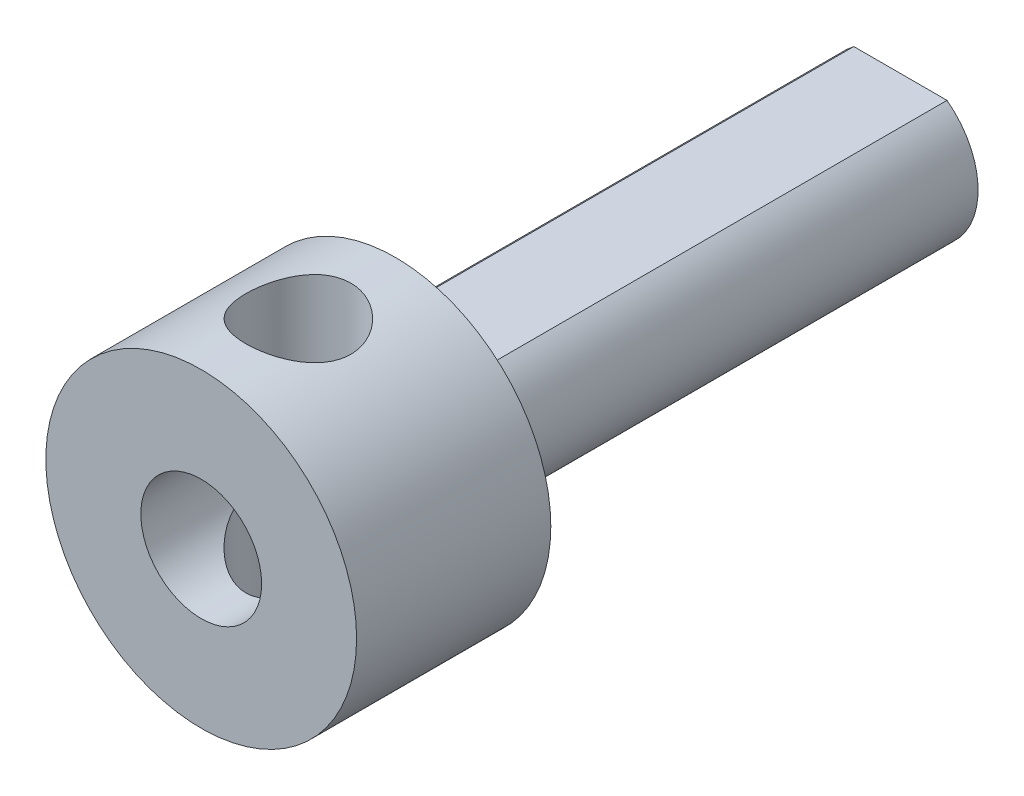
ISO-10303-21;
HEADER;
FILE_DESCRIPTION(('STEP AP214'),'2;1');
FILE_NAME('part.step','',(''),(''),'','','');
FILE_SCHEMA(('AUTOMOTIVE_DESIGN { 1 0 10303 214 1 1 1 1 }'));
ENDSEC;
DATA;
#1=APPLICATION_CONTEXT('core data for automotive mechanical design processes');
#2=APPLICATION_PROTOCOL_DEFINITION('international standard','automotive_design',2000,#1);
#3=PRODUCT_CONTEXT('',#1,'mechanical');
#4=PRODUCT('Part','Part','',(#3));
#5=PRODUCT_RELATED_PRODUCT_CATEGORY('part','',(#4));
#6=PRODUCT_DEFINITION_FORMATION('','',#4);
#7=PRODUCT_DEFINITION_CONTEXT('part definition',#1,'design');
#8=PRODUCT_DEFINITION('design','',#6,#7);
#9=PRODUCT_DEFINITION_SHAPE('','',#8);
#10=(LENGTH_UNIT() NAMED_UNIT(*) SI_UNIT(.MILLI.,.METRE.));
#11=(NAMED_UNIT(*) PLANE_ANGLE_UNIT() SI_UNIT($,.RADIAN.));
#12=(NAMED_UNIT(*) SI_UNIT($,.STERADIAN.) SOLID_ANGLE_UNIT());
#13=UNCERTAINTY_MEASURE_WITH_UNIT(LENGTH_MEASURE(1.E-05),#10,'distance_accuracy_value','');
#14=(GEOMETRIC_REPRESENTATION_CONTEXT(3) GLOBAL_UNCERTAINTY_ASSIGNED_CONTEXT((#13)) GLOBAL_UNIT_ASSIGNED_CONTEXT((#10,
#11,#12)) REPRESENTATION_CONTEXT('',''));
#15=CARTESIAN_POINT('',(0.,0.,0.));
#16=DIRECTION('',(0.,0.,1.));
#17=DIRECTION('',(1.,0.,0.));
#18=AXIS2_PLACEMENT_3D('',#15,#16,#17);
#19=CARTESIAN_POINT('',(0.,0.,0.));
#20=DIRECTION('',(0.,0.,1.));
#21=DIRECTION('',(1.,0.,0.));
#22=AXIS2_PLACEMENT_3D('',#19,#20,#21);
#23=PLANE('',#22);
#24=CARTESIAN_POINT('',(0.,0.,0.));
#25=DIRECTION('',(0.,0.,1.));
#26=DIRECTION('',(1.,0.,0.));
#27=AXIS2_PLACEMENT_3D('',#24,#25,#26);
#28=CIRCLE('',#27,4.);
#29=CARTESIAN_POINT('',(4.,0.,0.));
#30=VERTEX_POINT('',#29);
#31=EDGE_CURVE('E90',#30,#30,#28,.T.);
#32=ORIENTED_EDGE('',*,*,#31,.F.);
#33=EDGE_LOOP('',(#32));
#34=FACE_BOUND('',#33,.T.);
#35=CARTESIAN_POINT('',(0.,0.,0.));
#36=DIRECTION('',(0.,0.,-1.));
#37=DIRECTION('',(-1.,0.,0.));
#38=AXIS2_PLACEMENT_3D('',#35,#36,#37);
#39=CIRCLE('',#38,2.);
#40=CARTESIAN_POINT('',(1.2,1.6,0.));
#41=VERTEX_POINT('',#40);
#42=CARTESIAN_POINT('',(-1.2,1.6,0.));
#43=VERTEX_POINT('',#42);
#44=EDGE_CURVE('E54',#41,#43,#39,.T.);
#45=ORIENTED_EDGE('',*,*,#44,.F.);
#46=DIRECTION('',(-1.,0.,0.));
#47=VECTOR('',#46,1.);
#48=CARTESIAN_POINT('',(0.,1.6,0.));
#49=LINE('',#48,#47);
#50=EDGE_CURVE('E68',#41,#43,#49,.T.);
#51=ORIENTED_EDGE('',*,*,#50,.T.);
#52=EDGE_LOOP('',(#45,#51));
#53=FACE_BOUND('',#52,.T.);
#54=ADVANCED_FACE('F35',(#34,#53),#23,.F.);
#55=CARTESIAN_POINT('',(0.,0.,5.));
#56=DIRECTION('',(0.,0.,-1.));
#57=DIRECTION('',(-1.,0.,0.));
#58=AXIS2_PLACEMENT_3D('',#55,#56,#57);
#59=CYLINDRICAL_SURFACE('',#58,4.);
#60=CARTESIAN_POINT('',(0.,-4.,3.85254999999999));
#61=CARTESIAN_POINT('',(0.0737390509618184,-4.0000003652744,3.85255056006));
#62=CARTESIAN_POINT('',(0.147474310927837,-3.9979422676283,3.8465002378604));
#63=CARTESIAN_POINT('',(0.292769357385458,-3.98993514213324,3.82253545367694));
#64=CARTESIAN_POINT('',(0.364328979769022,-3.98398582152813,3.80462009902608));
#65=CARTESIAN_POINT('',(0.503157126306701,-3.96884184238156,3.75761210627711));
#66=CARTESIAN_POINT('',(0.570432722546803,-3.95965270522232,3.72853847699066));
#67=CARTESIAN_POINT('',(0.699152411861926,-3.93896448953899,3.66012633786681));
#68=CARTESIAN_POINT('',(0.760595299451358,-3.92746493502911,3.62078571235117));
#69=CARTESIAN_POINT('',(0.878087591662698,-3.90290684204576,3.5314897810976));
#70=CARTESIAN_POINT('',(0.933901351542575,-3.88981017965103,3.48123497253421));
#71=CARTESIAN_POINT('',(1.03648991777588,-3.86374115173317,3.372173848154));
#72=CARTESIAN_POINT('',(1.08326265549071,-3.85076881530033,3.31336558063725));
#73=CARTESIAN_POINT('',(1.16780306583327,-3.82599515792021,3.18672573613668));
#74=CARTESIAN_POINT('',(1.20526152944493,-3.81424014143166,3.11867780615096));
#75=CARTESIAN_POINT('',(1.2681013612762,-3.793813224202,2.97678648985272));
#76=CARTESIAN_POINT('',(1.29348653752226,-3.78514035154269,2.90294493947356));
#77=CARTESIAN_POINT('',(1.33057003933591,-3.77226179997908,2.75424635412494));
#78=CARTESIAN_POINT('',(1.34271089853046,-3.76791214685453,2.67951252606679));
#79=CARTESIAN_POINT('',(1.35434465925974,-3.76374712025534,2.52895169315452));
#80=CARTESIAN_POINT('',(1.35384160460854,-3.76393029707729,2.45312504556309));
#81=CARTESIAN_POINT('',(1.34054483005336,-3.76868428428414,2.3063337611442));
#82=CARTESIAN_POINT('',(1.32833239185101,-3.77304757543275,2.23530857478513));
#83=CARTESIAN_POINT('',(1.29291317512871,-3.78533000773349,2.09638185022601));
#84=CARTESIAN_POINT('',(1.26970504439218,-3.79324958622069,2.02848069733709));
#85=CARTESIAN_POINT('',(1.2125796956735,-3.81189752199324,1.89642399978096));
#86=CARTESIAN_POINT('',(1.17849266093029,-3.82266992332552,1.83234840398385));
#87=CARTESIAN_POINT('',(1.10069502115956,-3.84579168954526,1.71064455357942));
#88=CARTESIAN_POINT('',(1.05698157221814,-3.85814151999593,1.6530182118671));
#89=CARTESIAN_POINT('',(0.958394767498534,-3.88383915451425,1.54258739983186));
#90=CARTESIAN_POINT('',(0.903047375464347,-3.89720489555063,1.49020941408974));
#91=CARTESIAN_POINT('',(0.784190835217096,-3.92284799554659,1.39536555047655));
#92=CARTESIAN_POINT('',(0.720680859092592,-3.9351252438892,1.35290067930123));
#93=CARTESIAN_POINT('',(0.586377478003401,-3.95737745603798,1.27873171963862));
#94=CARTESIAN_POINT('',(0.515514792387584,-3.96732697545626,1.24714492256861));
#95=CARTESIAN_POINT('',(0.369064286005889,-3.98361761388867,1.19647367635713));
#96=CARTESIAN_POINT('',(0.29347816699625,-3.9899600242462,1.17738475261223));
#97=CARTESIAN_POINT('',(0.143334606318407,-3.99810645778428,1.15301369278033));
#98=CARTESIAN_POINT('',(0.0688808146920541,-4.00009970292712,1.14715549388714));
#99=CARTESIAN_POINT('',(-0.0799626683313179,-3.99989262166952,1.14776720531911));
#100=CARTESIAN_POINT('',(-0.154352368641951,-3.9976930264654,1.15423496609985));
#101=CARTESIAN_POINT('',(-0.298630325753243,-3.98947237211125,1.17886093786743));
#102=CARTESIAN_POINT('',(-0.368586673962148,-3.98356782182736,1.19666296475717));
#103=CARTESIAN_POINT('',(-0.504489462163015,-3.96864809967418,1.24300423049516));
#104=CARTESIAN_POINT('',(-0.570435386895209,-3.95963252908952,1.27154484566742));
#105=CARTESIAN_POINT('',(-0.698410294101007,-3.93910368260848,1.33939669099171));
#106=CARTESIAN_POINT('',(-0.760287564381749,-3.92753011320835,1.37897529645741));
#107=CARTESIAN_POINT('',(-0.876708176692176,-3.9031943071523,1.46746695977094));
#108=CARTESIAN_POINT('',(-0.931249212732041,-3.89043169887101,1.51638294099124));
#109=CARTESIAN_POINT('',(-1.03410865095364,-3.86439742013857,1.62486854702729));
#110=CARTESIAN_POINT('',(-1.08201607624762,-3.85112989689448,1.68482978528195));
#111=CARTESIAN_POINT('',(-1.1671430673832,-3.82619275797566,1.81222339044417));
#112=CARTESIAN_POINT('',(-1.20436246945168,-3.81452316678755,1.87965587181204));
#113=CARTESIAN_POINT('',(-1.26690207526012,-3.79421204563183,2.02015433486791));
#114=CARTESIAN_POINT('',(-1.29223999157417,-3.78556601315449,2.09321174056244));
#115=CARTESIAN_POINT('',(-1.33013343190278,-3.77242033377096,2.24291805866598));
#116=CARTESIAN_POINT('',(-1.34269493711504,-3.76791874676199,2.31956527293252));
#117=CARTESIAN_POINT('',(-1.35420428715988,-3.76379652207792,2.46991853348414));
#118=CARTESIAN_POINT('',(-1.35383624769368,-3.76393060026203,2.54356605318321));
#119=CARTESIAN_POINT('',(-1.34118827642512,-3.76845566270461,2.68969093920701));
#120=CARTESIAN_POINT('',(-1.32890909347553,-3.7728463793485,2.76216837880338));
#121=CARTESIAN_POINT('',(-1.29327749830683,-3.78520481653253,2.90244091757961));
#122=CARTESIAN_POINT('',(-1.27015285741645,-3.7930987880036,2.9703008866313));
#123=CARTESIAN_POINT('',(-1.21367284791613,-3.81154517911969,3.10122880348786));
#124=CARTESIAN_POINT('',(-1.18031516760581,-3.82209819936226,3.16429566448212));
#125=CARTESIAN_POINT('',(-1.10257812997164,-3.84526124892901,3.28690186227075));
#126=CARTESIAN_POINT('',(-1.0577729746199,-3.85794211029656,3.34615775539958));
#127=CARTESIAN_POINT('',(-0.959125818306253,-3.88364165900639,3.45653058996261));
#128=CARTESIAN_POINT('',(-0.905281227791766,-3.89666044224806,3.50764519093755));
#129=CARTESIAN_POINT('',(-0.787463330671121,-3.92220271600919,3.60237630003147));
#130=CARTESIAN_POINT('',(-0.723167865506797,-3.93468472207405,3.64560476128542));
#131=CARTESIAN_POINT('',(-0.587808236572525,-3.95716814430872,3.72059634415163));
#132=CARTESIAN_POINT('',(-0.516745575892186,-3.96717010956017,3.75236200434126));
#133=CARTESIAN_POINT('',(-0.372423161492995,-3.98326295233837,3.80242809971874));
#134=CARTESIAN_POINT('',(-0.299328134068115,-3.98947881260907,3.82116212002658));
#135=CARTESIAN_POINT('',(-0.150820286948907,-3.99784654720756,3.84622094419734));
#136=CARTESIAN_POINT('',(-0.0754081611948086,-3.99999962645748,3.85254942726283));
#137=CARTESIAN_POINT('',(0.,-4.,3.85254999999999));
#138=B_SPLINE_CURVE_WITH_KNOTS('',3,(#60,#61,#62,#63,#64,#65,#66,#67,#68,#69,#70,#71,#72,#73,
#74,#75,#76,#77,#78,#79,#80,#81,#82,#83,#84,#85,#86,#87,#88,#89,#90,#91,#92,#93,#94,#95,#96,#97,
#98,#99,#100,#101,#102,#103,#104,#105,#106,#107,#108,#109,#110,#111,#112,#113,#114,#115,#116,
#117,#118,#119,#120,#121,#122,#123,#124,#125,#126,#127,#128,#129,#130,#131,#132,#133,#134,#135,
#136,#137),.UNSPECIFIED.,.T.,.F.,(4,2,2,2,2,2,2,2,2,2,2,2,2,2,2,2,2,2,2,2,2,2,2,2,2,2,2,2,2,2,2,
2,2,2,2,2,2,2,4),(0.,0.220939581068784,0.441895786439387,0.662477238152886,0.88310418013091,
1.11079439594426,1.33853664709934,1.57305252102399,1.80749437733888,2.03383714603689,
2.26010752603993,2.47569718163393,2.69131335666791,2.91047495342985,3.12970138376854,
3.3607276034257,3.59177727404101,3.82524545926201,4.058630010282,4.28163932601376,
4.50460975434197,4.72089753822,4.93721305232834,5.15930761136237,5.38147181878623,
5.61403918754245,5.84661011975027,6.07883323098321,6.31094757829824,6.53079998026519,
6.7506385610225,6.96605385334918,7.18151784506628,7.4066072008356,7.63176114896825,
7.86604414860135,8.10027523151229,8.32628289926542,8.55222352809417),.UNSPECIFIED.);
#139=CARTESIAN_POINT('',(0.,-4.,3.85254999999999));
#140=VERTEX_POINT('',#139);
#141=EDGE_CURVE('E11',#140,#140,#138,.T.);
#142=ORIENTED_EDGE('',*,*,#141,.T.);
#143=EDGE_LOOP('',(#142));
#144=FACE_BOUND('',#143,.T.);
#145=CARTESIAN_POINT('',(0.,4.,3.85254999999999));
#146=CARTESIAN_POINT('',(-0.0737390509618184,4.0000003652744,3.85255056006));
#147=CARTESIAN_POINT('',(-0.147474310927837,3.9979422676283,3.8465002378604));
#148=CARTESIAN_POINT('',(-0.292769357385458,3.98993514213324,3.82253545367694));
#149=CARTESIAN_POINT('',(-0.364328979769022,3.98398582152813,3.80462009902608));
#150=CARTESIAN_POINT('',(-0.503157126306701,3.96884184238156,3.75761210627711));
#151=CARTESIAN_POINT('',(-0.570432722546803,3.95965270522232,3.72853847699066));
#152=CARTESIAN_POINT('',(-0.699152411861926,3.93896448953899,3.66012633786681));
#153=CARTESIAN_POINT('',(-0.760595299451358,3.92746493502911,3.62078571235117));
#154=CARTESIAN_POINT('',(-0.878087591662698,3.90290684204576,3.5314897810976));
#155=CARTESIAN_POINT('',(-0.933901351542575,3.88981017965103,3.48123497253421));
#156=CARTESIAN_POINT('',(-1.03648991777588,3.86374115173317,3.372173848154));
#157=CARTESIAN_POINT('',(-1.08326265549071,3.85076881530033,3.31336558063725));
#158=CARTESIAN_POINT('',(-1.16780306583327,3.82599515792021,3.18672573613668));
#159=CARTESIAN_POINT('',(-1.20526152944493,3.81424014143166,3.11867780615096));
#160=CARTESIAN_POINT('',(-1.2681013612762,3.793813224202,2.97678648985272));
#161=CARTESIAN_POINT('',(-1.29348653752226,3.78514035154269,2.90294493947356));
#162=CARTESIAN_POINT('',(-1.33057003933591,3.77226179997908,2.75424635412494));
#163=CARTESIAN_POINT('',(-1.34271089853046,3.76791214685453,2.67951252606679));
#164=CARTESIAN_POINT('',(-1.35434465925974,3.76374712025534,2.52895169315452));
#165=CARTESIAN_POINT('',(-1.35384160460854,3.76393029707729,2.45312504556309));
#166=CARTESIAN_POINT('',(-1.34054483005336,3.76868428428414,2.3063337611442));
#167=CARTESIAN_POINT('',(-1.32833239185101,3.77304757543275,2.23530857478513));
#168=CARTESIAN_POINT('',(-1.29291317512871,3.78533000773349,2.09638185022601));
#169=CARTESIAN_POINT('',(-1.26970504439218,3.79324958622069,2.02848069733709));
#170=CARTESIAN_POINT('',(-1.2125796956735,3.81189752199324,1.89642399978096));
#171=CARTESIAN_POINT('',(-1.17849266093029,3.82266992332552,1.83234840398385));
#172=CARTESIAN_POINT('',(-1.10069502115956,3.84579168954526,1.71064455357942));
#173=CARTESIAN_POINT('',(-1.05698157221814,3.85814151999593,1.6530182118671));
#174=CARTESIAN_POINT('',(-0.958394767498534,3.88383915451425,1.54258739983186));
#175=CARTESIAN_POINT('',(-0.903047375464347,3.89720489555063,1.49020941408974));
#176=CARTESIAN_POINT('',(-0.784190835217096,3.92284799554659,1.39536555047655));
#177=CARTESIAN_POINT('',(-0.720680859092592,3.9351252438892,1.35290067930123));
#178=CARTESIAN_POINT('',(-0.586377478003401,3.95737745603798,1.27873171963862));
#179=CARTESIAN_POINT('',(-0.515514792387584,3.96732697545626,1.24714492256861));
#180=CARTESIAN_POINT('',(-0.369064286005889,3.98361761388867,1.19647367635713));
#181=CARTESIAN_POINT('',(-0.29347816699625,3.9899600242462,1.17738475261223));
#182=CARTESIAN_POINT('',(-0.143334606318407,3.99810645778428,1.15301369278033));
#183=CARTESIAN_POINT('',(-0.0688808146920541,4.00009970292712,1.14715549388714));
#184=CARTESIAN_POINT('',(0.0799626683313179,3.99989262166952,1.14776720531911));
#185=CARTESIAN_POINT('',(0.154352368641951,3.9976930264654,1.15423496609985));
#186=CARTESIAN_POINT('',(0.298630325753243,3.98947237211125,1.17886093786743));
#187=CARTESIAN_POINT('',(0.368586673962148,3.98356782182736,1.19666296475717));
#188=CARTESIAN_POINT('',(0.504489462163015,3.96864809967418,1.24300423049516));
#189=CARTESIAN_POINT('',(0.570435386895209,3.95963252908952,1.27154484566742));
#190=CARTESIAN_POINT('',(0.698410294101007,3.93910368260848,1.33939669099171));
#191=CARTESIAN_POINT('',(0.760287564381749,3.92753011320835,1.37897529645741));
#192=CARTESIAN_POINT('',(0.876708176692176,3.9031943071523,1.46746695977094));
#193=CARTESIAN_POINT('',(0.931249212732041,3.89043169887101,1.51638294099124));
#194=CARTESIAN_POINT('',(1.03410865095364,3.86439742013857,1.62486854702729));
#195=CARTESIAN_POINT('',(1.08201607624762,3.85112989689448,1.68482978528195));
#196=CARTESIAN_POINT('',(1.1671430673832,3.82619275797566,1.81222339044417));
#197=CARTESIAN_POINT('',(1.20436246945168,3.81452316678755,1.87965587181204));
#198=CARTESIAN_POINT('',(1.26690207526012,3.79421204563183,2.02015433486791));
#199=CARTESIAN_POINT('',(1.29223999157417,3.78556601315449,2.09321174056244));
#200=CARTESIAN_POINT('',(1.33013343190278,3.77242033377096,2.24291805866598));
#201=CARTESIAN_POINT('',(1.34269493711504,3.76791874676199,2.31956527293252));
#202=CARTESIAN_POINT('',(1.35420428715988,3.76379652207792,2.46991853348414));
#203=CARTESIAN_POINT('',(1.35383624769368,3.76393060026203,2.54356605318321));
#204=CARTESIAN_POINT('',(1.34118827642512,3.76845566270461,2.68969093920701));
#205=CARTESIAN_POINT('',(1.32890909347553,3.7728463793485,2.76216837880338));
#206=CARTESIAN_POINT('',(1.29327749830683,3.78520481653253,2.90244091757961));
#207=CARTESIAN_POINT('',(1.27015285741645,3.7930987880036,2.9703008866313));
#208=CARTESIAN_POINT('',(1.21367284791613,3.81154517911969,3.10122880348786));
#209=CARTESIAN_POINT('',(1.18031516760581,3.82209819936226,3.16429566448212));
#210=CARTESIAN_POINT('',(1.10257812997164,3.84526124892901,3.28690186227075));
#211=CARTESIAN_POINT('',(1.0577729746199,3.85794211029656,3.34615775539958));
#212=CARTESIAN_POINT('',(0.959125818306253,3.88364165900639,3.45653058996261));
#213=CARTESIAN_POINT('',(0.905281227791766,3.89666044224806,3.50764519093755));
#214=CARTESIAN_POINT('',(0.787463330671121,3.92220271600919,3.60237630003147));
#215=CARTESIAN_POINT('',(0.723167865506797,3.93468472207405,3.64560476128542));
#216=CARTESIAN_POINT('',(0.587808236572525,3.95716814430872,3.72059634415163));
#217=CARTESIAN_POINT('',(0.516745575892186,3.96717010956017,3.75236200434126));
#218=CARTESIAN_POINT('',(0.372423161492994,3.98326295233837,3.80242809971874));
#219=CARTESIAN_POINT('',(0.299328134068115,3.98947881260907,3.82116212002658));
#220=CARTESIAN_POINT('',(0.150820286948907,3.99784654720756,3.84622094419734));
#221=CARTESIAN_POINT('',(0.0754081611948085,3.99999962645748,3.85254942726283));
#222=CARTESIAN_POINT('',(0.,4.,3.85254999999999));
#223=B_SPLINE_CURVE_WITH_KNOTS('',3,(#145,#146,#147,#148,#149,#150,#151,#152,#153,#154,#155,
#156,#157,#158,#159,#160,#161,#162,#163,#164,#165,#166,#167,#168,#169,#170,#171,#172,#173,#174,
#175,#176,#177,#178,#179,#180,#181,#182,#183,#184,#185,#186,#187,#188,#189,#190,#191,#192,#193,
#194,#195,#196,#197,#198,#199,#200,#201,#202,#203,#204,#205,#206,#207,#208,#209,#210,#211,#212,
#213,#214,#215,#216,#217,#218,#219,#220,#221,#222),.UNSPECIFIED.,.T.,.F.,(4,2,2,2,2,2,2,2,2,2,2,
2,2,2,2,2,2,2,2,2,2,2,2,2,2,2,2,2,2,2,2,2,2,2,2,2,2,2,4),(0.,0.220939581068784,
0.441895786439387,0.662477238152887,0.88310418013091,1.11079439594426,1.33853664709934,
1.57305252102399,1.80749437733888,2.03383714603689,2.26010752603994,2.47569718163393,
2.69131335666791,2.91047495342985,3.12970138376854,3.3607276034257,3.59177727404101,
3.82524545926201,4.058630010282,4.28163932601376,4.50460975434197,4.72089753822,
4.93721305232834,5.15930761136237,5.38147181878623,5.61403918754246,5.84661011975027,
6.07883323098321,6.31094757829824,6.53079998026519,6.7506385610225,6.96605385334918,
7.18151784506628,7.4066072008356,7.63176114896825,7.86604414860135,8.10027523151229,
8.32628289926542,8.55222352809417),.UNSPECIFIED.);
#224=CARTESIAN_POINT('',(0.,4.,3.85254999999999));
#225=VERTEX_POINT('',#224);
#226=EDGE_CURVE('E48',#225,#225,#223,.T.);
#227=ORIENTED_EDGE('',*,*,#226,.T.);
#228=EDGE_LOOP('',(#227));
#229=FACE_BOUND('',#228,.T.);
#230=CARTESIAN_POINT('',(0.,0.,5.));
#231=DIRECTION('',(0.,0.,1.));
#232=DIRECTION('',(1.,0.,0.));
#233=AXIS2_PLACEMENT_3D('',#230,#231,#232);
#234=CIRCLE('',#233,4.);
#235=CARTESIAN_POINT('',(4.,0.,5.));
#236=VERTEX_POINT('',#235);
#237=EDGE_CURVE('E93',#236,#236,#234,.T.);
#238=ORIENTED_EDGE('',*,*,#237,.F.);
#239=EDGE_LOOP('',(#238));
#240=FACE_BOUND('',#239,.T.);
#241=ORIENTED_EDGE('',*,*,#31,.T.);
#242=EDGE_LOOP('',(#241));
#243=FACE_BOUND('',#242,.T.);
#244=ADVANCED_FACE('F37',(#144,#229,#240,#243),#59,.T.);
#245=CARTESIAN_POINT('',(0.,0.,5.));
#246=DIRECTION('',(0.,0.,1.));
#247=DIRECTION('',(1.,0.,0.));
#248=AXIS2_PLACEMENT_3D('',#245,#246,#247);
#249=PLANE('',#248);
#250=CARTESIAN_POINT('',(0.,0.,5.));
#251=DIRECTION('',(0.,0.,1.));
#252=DIRECTION('',(1.,0.,0.));
#253=AXIS2_PLACEMENT_3D('',#250,#251,#252);
#254=CIRCLE('',#253,1.555);
#255=CARTESIAN_POINT('',(1.555,0.,5.));
#256=VERTEX_POINT('',#255);
#257=EDGE_CURVE('E86',#256,#256,#254,.T.);
#258=ORIENTED_EDGE('',*,*,#257,.F.);
#259=EDGE_LOOP('',(#258));
#260=FACE_BOUND('',#259,.T.);
#261=ORIENTED_EDGE('',*,*,#237,.T.);
#262=EDGE_LOOP('',(#261));
#263=FACE_BOUND('',#262,.T.);
#264=ADVANCED_FACE('F129',(#260,#263),#249,.T.);
#265=CARTESIAN_POINT('',(0.,0.,1.));
#266=DIRECTION('',(0.,0.,1.));
#267=DIRECTION('',(1.,0.,0.));
#268=AXIS2_PLACEMENT_3D('',#265,#266,#267);
#269=CYLINDRICAL_SURFACE('',#268,1.555);
#270=CARTESIAN_POINT('',(0.,-1.555,3.85254999999999));
#271=CARTESIAN_POINT('',(-0.0634208857405645,-1.55499913362226,3.85254912161558));
#272=CARTESIAN_POINT('',(-0.126847740464505,-1.55108791734117,3.84805781385923));
#273=CARTESIAN_POINT('',(-0.251563549806269,-1.53580451745603,3.83044380329821));
#274=CARTESIAN_POINT('',(-0.312851314550988,-1.52442824892799,3.81731637474337));
#275=CARTESIAN_POINT('',(-0.431199602065749,-1.49525523055035,3.78344396178162));
#276=CARTESIAN_POINT('',(-0.488283344684581,-1.4774975310214,3.76274529508399));
#277=CARTESIAN_POINT('',(-0.597607002635973,-1.43676775537636,3.71483581733928));
#278=CARTESIAN_POINT('',(-0.649844989540499,-1.41379361574697,3.6876224289741));
#279=CARTESIAN_POINT('',(-0.768086683416059,-1.35424233213501,3.61618612506015));
#280=CARTESIAN_POINT('',(-0.831648341730146,-1.31583319960547,3.56944807837608));
#281=CARTESIAN_POINT('',(-0.948310836942764,-1.23443059840987,3.46753780036242));
#282=CARTESIAN_POINT('',(-1.00138325679002,-1.19142514978483,3.41234335753943));
#283=CARTESIAN_POINT('',(-1.09816505744701,-1.10291519547781,3.29337230124312));
#284=CARTESIAN_POINT('',(-1.14165006713979,-1.05737692192664,3.22943746818669));
#285=CARTESIAN_POINT('',(-1.19863934613538,-0.991032581108011,3.12781675863433));
#286=CARTESIAN_POINT('',(-1.21625487509267,-0.969257078871723,3.09301202211705));
#287=CARTESIAN_POINT('',(-1.24866897067999,-0.927121165811011,3.0213112908193));
#288=CARTESIAN_POINT('',(-1.26346973378204,-0.906759659532944,2.9844169560559));
#289=CARTESIAN_POINT('',(-1.29057220305554,-0.867774219774612,2.90689562384742));
#290=CARTESIAN_POINT('',(-1.30276032346032,-0.849243226617585,2.8661807891439));
#291=CARTESIAN_POINT('',(-1.32349548339746,-0.816554009150317,2.78216053780056));
#292=CARTESIAN_POINT('',(-1.33205003848289,-0.80238677583235,2.73886068174997));
#293=CARTESIAN_POINT('',(-1.34399037176902,-0.782198397412323,2.65663912904975));
#294=CARTESIAN_POINT('',(-1.34795839324691,-0.775274993785752,2.61803298751181));
#295=CARTESIAN_POINT('',(-1.35251932112543,-0.767294325886984,2.54003705369967));
#296=CARTESIAN_POINT('',(-1.35311683564468,-0.766229052496155,2.50064840528178));
#297=CARTESIAN_POINT('',(-1.35088615761599,-0.77015235050189,2.422320301576));
#298=CARTESIAN_POINT('',(-1.34806052045575,-0.775136406070848,2.38338053309416));
#299=CARTESIAN_POINT('',(-1.33924691396229,-0.790264100177822,2.30686991494736));
#300=CARTESIAN_POINT('',(-1.33325283861234,-0.800417699743261,2.26930185872626));
#301=CARTESIAN_POINT('',(-1.31381711909997,-0.832123746175846,2.17289156148182));
#302=CARTESIAN_POINT('',(-1.29806265163729,-0.856826273696365,2.11558020321153));
#303=CARTESIAN_POINT('',(-1.2603126813152,-0.911454166590484,2.00562413358714));
#304=CARTESIAN_POINT('',(-1.23829114456787,-0.941401113775779,1.95300011695031));
#305=CARTESIAN_POINT('',(-1.19402275809985,-0.996645094984837,1.86311870857222));
#306=CARTESIAN_POINT('',(-1.17289823045326,-1.02150972898756,1.82503310724842));
#307=CARTESIAN_POINT('',(-1.12724136509439,-1.0716834890945,1.75126613245747));
#308=CARTESIAN_POINT('',(-1.10270724881723,-1.09699284112131,1.71558602830491));
#309=CARTESIAN_POINT('',(-1.02405770763177,-1.17242701004693,1.61219757114392));
#310=CARTESIAN_POINT('',(-0.96480462562139,-1.22217788347305,1.54795817967787));
#311=CARTESIAN_POINT('',(-0.848146809950309,-1.30480858649993,1.44425346581716));
#312=CARTESIAN_POINT('',(-0.793601176319503,-1.33890028410075,1.4025183121789));
#313=CARTESIAN_POINT('',(-0.676586029170272,-1.40165616549593,1.32677350637869));
#314=CARTESIAN_POINT('',(-0.614129933730502,-1.43032933984128,1.29275103807076));
#315=CARTESIAN_POINT('',(-0.494106028393084,-1.47553994405997,1.23954730417508));
#316=CARTESIAN_POINT('',(-0.437714541645772,-1.49333604137982,1.2187922871255));
#317=CARTESIAN_POINT('',(-0.32115148048788,-1.52265838350912,1.18473156621179));
#318=CARTESIAN_POINT('',(-0.260982151173645,-1.53418831356292,1.17142148371447));
#319=CARTESIAN_POINT('',(-0.13813493769365,-1.5500953327461,1.15308386621893));
#320=CARTESIAN_POINT('',(-0.0754462047620189,-1.55443709039341,1.14809724191079));
#321=CARTESIAN_POINT('',(0.0500751005219802,-1.55545942038044,1.14692173825386));
#322=CARTESIAN_POINT('',(0.112907652119496,-1.55214103614162,1.15073166068895));
#323=CARTESIAN_POINT('',(0.231651891499559,-1.53871678935574,1.16619764889332));
#324=CARTESIAN_POINT('',(0.287715856297409,-1.52917343457563,1.17720363641282));
#325=CARTESIAN_POINT('',(0.396858775704148,-1.5045466537283,1.20575154468328));
#326=CARTESIAN_POINT('',(0.449937205462069,-1.48946225704551,1.22329461053171));
#327=CARTESIAN_POINT('',(0.556001360660312,-1.45336017671921,1.26559595269681));
#328=CARTESIAN_POINT('',(0.608688163988292,-1.43198537928507,1.29079290342669));
#329=CARTESIAN_POINT('',(0.708995390453057,-1.38507160609381,1.34673464867329));
#330=CARTESIAN_POINT('',(0.756612448380897,-1.35952989253998,1.37748309212431));
#331=CARTESIAN_POINT('',(0.869727999678065,-1.29147811141788,1.46070918273249));
#332=CARTESIAN_POINT('',(0.931816055803393,-1.24700068937648,1.51622525703549));
#333=CARTESIAN_POINT('',(1.04398899126762,-1.1547266927775,1.63613825787288));
#334=CARTESIAN_POINT('',(1.09404145004324,-1.10692159078266,1.7005584514196));
#335=CARTESIAN_POINT('',(1.17424380502417,-1.02078038888495,1.82544684353372));
#336=CARTESIAN_POINT('',(1.20635245732807,-0.982280784603915,1.88455905244982));
#337=CARTESIAN_POINT('',(1.26212175205141,-0.909473765913088,2.00900472110552));
#338=CARTESIAN_POINT('',(1.28580994832855,-0.875152924541642,2.07431698684542));
#339=CARTESIAN_POINT('',(1.31522015548947,-0.82982592768574,2.18190428107237));
#340=CARTESIAN_POINT('',(1.32426450575148,-0.81519801594742,2.22171042346176));
#341=CARTESIAN_POINT('',(1.33883062233718,-0.791047401243176,2.3034313072858));
#342=CARTESIAN_POINT('',(1.34436146816187,-0.781511549777284,2.34534030931628));
#343=CARTESIAN_POINT('',(1.35148024778668,-0.769145607953862,2.43104505369282));
#344=CARTESIAN_POINT('',(1.35302079527987,-0.76639612619197,2.47485724394057));
#345=CARTESIAN_POINT('',(1.35182475806378,-0.768501437392978,2.56224458468205));
#346=CARTESIAN_POINT('',(1.34908600069107,-0.77336009311732,2.60581960348726));
#347=CARTESIAN_POINT('',(1.33895414735122,-0.790781957271081,2.69757603492102));
#348=CARTESIAN_POINT('',(1.33092925890736,-0.80438380857736,2.74547835504705));
#349=CARTESIAN_POINT('',(1.31042689363522,-0.837364540011899,2.8383056741632));
#350=CARTESIAN_POINT('',(1.29793277063625,-0.856764972586022,2.88321878760619));
#351=CARTESIAN_POINT('',(1.27105787711344,-0.896060937909012,2.96406699879908));
#352=CARTESIAN_POINT('',(1.25717268752475,-0.915521659847424,3.00038746691065));
#353=CARTESIAN_POINT('',(1.22670853618055,-0.955957454757107,3.07101352133487));
#354=CARTESIAN_POINT('',(1.21012767627268,-0.976933588978478,3.10531766451087));
#355=CARTESIAN_POINT('',(1.15646428288465,-1.04101205531277,3.20550668061161));
#356=CARTESIAN_POINT('',(1.11547683511355,-1.08523955997135,3.2686216606166));
#357=CARTESIAN_POINT('',(1.02017834286077,-1.17553430513639,3.39166972996011));
#358=CARTESIAN_POINT('',(0.965160426880547,-1.22152721526415,3.45110900309371));
#359=CARTESIAN_POINT('',(0.843281877063057,-1.30861834198616,3.56063218395772));
#360=CARTESIAN_POINT('',(0.776450964092924,-1.34972841937733,3.61073893680032));
#361=CARTESIAN_POINT('',(0.651482522754707,-1.41317123232677,3.68689719554177));
#362=CARTESIAN_POINT('',(0.596098898281404,-1.43754609879118,3.71576284577824));
#363=CARTESIAN_POINT('',(0.479926707065062,-1.48037592278435,3.76611848327241));
#364=CARTESIAN_POINT('',(0.419143762446115,-1.4988369480005,3.78761603190413));
#365=CARTESIAN_POINT('',(0.299269115061991,-1.5270544406396,3.82034974269395));
#366=CARTESIAN_POINT('',(0.240541731445175,-1.53745850146029,3.83235159494328));
#367=CARTESIAN_POINT('',(0.121210925187027,-1.55143046047365,3.84845071570271));
#368=CARTESIAN_POINT('',(0.0606081882327414,-1.55500082795415,3.85255083942832));
#369=CARTESIAN_POINT('',(0.,-1.555,3.85254999999999));
#370=B_SPLINE_CURVE_WITH_KNOTS('',3,(#270,#271,#272,#273,#274,#275,#276,#277,#278,#279,#280,
#281,#282,#283,#284,#285,#286,#287,#288,#289,#290,#291,#292,#293,#294,#295,#296,#297,#298,#299,
#300,#301,#302,#303,#304,#305,#306,#307,#308,#309,#310,#311,#312,#313,#314,#315,#316,#317,#318,
#319,#320,#321,#322,#323,#324,#325,#326,#327,#328,#329,#330,#331,#332,#333,#334,#335,#336,#337,
#338,#339,#340,#341,#342,#343,#344,#345,#346,#347,#348,#349,#350,#351,#352,#353,#354,#355,#356,
#357,#358,#359,#360,#361,#362,#363,#364,#365,#366,#367,#368,#369),.UNSPECIFIED.,.T.,.F.,(4,2,2,
2,2,2,2,2,2,2,2,2,2,2,2,2,2,2,2,2,2,2,2,2,2,2,2,2,2,2,2,2,2,2,2,2,2,2,2,2,2,2,2,2,2,2,2,2,2,4),
(0.,0.190006743437861,0.380117546573418,0.569084267028985,0.758125869355401,1.01994045162447,
1.28245489171477,1.55058030412449,1.68448727974769,1.81828932985976,1.95707397987159,
2.09557015744064,2.21332359028367,2.33091599288628,2.44842066665571,2.56615261814898,
2.7581588273323,2.95097458853818,3.10123669257942,3.2515774750549,3.55155698075073,
3.78079704240623,4.00965333776649,4.19689377360098,4.38402397051184,4.57207125290872,
4.76009292207362,4.93311726151687,5.1061719238249,5.29206317487717,5.47807705796866,
5.75982922334944,6.04233205571665,6.27427709224888,6.50545600361495,6.63517980686805,
6.76456700295676,6.89548382120208,7.02646712936379,7.17693621385746,7.32797167502308,
7.45824118233255,7.58860281921423,7.84948954185688,8.12779522346387,8.40541041882038,
8.6057929796961,8.8059692817056,8.98761493058807,9.16919493120302),.UNSPECIFIED.);
#371=CARTESIAN_POINT('',(0.,-1.555,3.85254999999999));
#372=VERTEX_POINT('',#371);
#373=EDGE_CURVE('E71',#372,#372,#370,.T.);
#374=ORIENTED_EDGE('',*,*,#373,.T.);
#375=EDGE_LOOP('',(#374));
#376=FACE_BOUND('',#375,.T.);
#377=CARTESIAN_POINT('',(0.,1.555,3.85254999999999));
#378=CARTESIAN_POINT('',(0.0634208857405645,1.55499913362226,3.85254912161558));
#379=CARTESIAN_POINT('',(0.126847740464505,1.55108791734117,3.84805781385923));
#380=CARTESIAN_POINT('',(0.251563549806269,1.53580451745603,3.83044380329821));
#381=CARTESIAN_POINT('',(0.312851314550988,1.52442824892799,3.81731637474337));
#382=CARTESIAN_POINT('',(0.431199602065749,1.49525523055035,3.78344396178162));
#383=CARTESIAN_POINT('',(0.488283344684581,1.4774975310214,3.76274529508399));
#384=CARTESIAN_POINT('',(0.597607002635973,1.43676775537636,3.71483581733928));
#385=CARTESIAN_POINT('',(0.649844989540499,1.41379361574697,3.6876224289741));
#386=CARTESIAN_POINT('',(0.768086683416059,1.35424233213501,3.61618612506015));
#387=CARTESIAN_POINT('',(0.831648341730146,1.31583319960547,3.56944807837608));
#388=CARTESIAN_POINT('',(0.948310836942764,1.23443059840987,3.46753780036242));
#389=CARTESIAN_POINT('',(1.00138325679002,1.19142514978483,3.41234335753943));
#390=CARTESIAN_POINT('',(1.09816505744701,1.10291519547781,3.29337230124312));
#391=CARTESIAN_POINT('',(1.14165006713979,1.05737692192664,3.22943746818669));
#392=CARTESIAN_POINT('',(1.19863934613538,0.991032581108011,3.12781675863433));
#393=CARTESIAN_POINT('',(1.21625487509267,0.969257078871723,3.09301202211705));
#394=CARTESIAN_POINT('',(1.24866897067999,0.927121165811011,3.0213112908193));
#395=CARTESIAN_POINT('',(1.26346973378204,0.906759659532944,2.9844169560559));
#396=CARTESIAN_POINT('',(1.29057220305554,0.867774219774612,2.90689562384742));
#397=CARTESIAN_POINT('',(1.30276032346032,0.849243226617585,2.8661807891439));
#398=CARTESIAN_POINT('',(1.32349548339746,0.816554009150317,2.78216053780056));
#399=CARTESIAN_POINT('',(1.33205003848289,0.80238677583235,2.73886068174997));
#400=CARTESIAN_POINT('',(1.34399037176902,0.782198397412323,2.65663912904975));
#401=CARTESIAN_POINT('',(1.34795839324691,0.775274993785752,2.61803298751181));
#402=CARTESIAN_POINT('',(1.35251932112543,0.767294325886984,2.54003705369967));
#403=CARTESIAN_POINT('',(1.35311683564468,0.766229052496155,2.50064840528178));
#404=CARTESIAN_POINT('',(1.35088615761599,0.77015235050189,2.422320301576));
#405=CARTESIAN_POINT('',(1.34806052045575,0.775136406070848,2.38338053309416));
#406=CARTESIAN_POINT('',(1.33924691396229,0.790264100177822,2.30686991494736));
#407=CARTESIAN_POINT('',(1.33325283861234,0.800417699743261,2.26930185872626));
#408=CARTESIAN_POINT('',(1.31381711909997,0.832123746175846,2.17289156148182));
#409=CARTESIAN_POINT('',(1.29806265163729,0.856826273696365,2.11558020321153));
#410=CARTESIAN_POINT('',(1.2603126813152,0.911454166590484,2.00562413358714));
#411=CARTESIAN_POINT('',(1.23829114456787,0.941401113775779,1.95300011695031));
#412=CARTESIAN_POINT('',(1.19402275809985,0.996645094984837,1.86311870857222));
#413=CARTESIAN_POINT('',(1.17289823045326,1.02150972898756,1.82503310724842));
#414=CARTESIAN_POINT('',(1.12724136509439,1.0716834890945,1.75126613245747));
#415=CARTESIAN_POINT('',(1.10270724881723,1.09699284112131,1.71558602830491));
#416=CARTESIAN_POINT('',(1.02405770763177,1.17242701004693,1.61219757114392));
#417=CARTESIAN_POINT('',(0.96480462562139,1.22217788347305,1.54795817967787));
#418=CARTESIAN_POINT('',(0.848146809950309,1.30480858649993,1.44425346581716));
#419=CARTESIAN_POINT('',(0.793601176319503,1.33890028410075,1.4025183121789));
#420=CARTESIAN_POINT('',(0.676586029170272,1.40165616549593,1.32677350637869));
#421=CARTESIAN_POINT('',(0.614129933730502,1.43032933984128,1.29275103807076));
#422=CARTESIAN_POINT('',(0.494106028393084,1.47553994405997,1.23954730417508));
#423=CARTESIAN_POINT('',(0.437714541645772,1.49333604137982,1.2187922871255));
#424=CARTESIAN_POINT('',(0.32115148048788,1.52265838350912,1.18473156621179));
#425=CARTESIAN_POINT('',(0.260982151173645,1.53418831356292,1.17142148371447));
#426=CARTESIAN_POINT('',(0.13813493769365,1.5500953327461,1.15308386621893));
#427=CARTESIAN_POINT('',(0.0754462047620189,1.55443709039341,1.14809724191079));
#428=CARTESIAN_POINT('',(-0.0500751005219802,1.55545942038044,1.14692173825386));
#429=CARTESIAN_POINT('',(-0.112907652119496,1.55214103614162,1.15073166068895));
#430=CARTESIAN_POINT('',(-0.231651891499559,1.53871678935574,1.16619764889332));
#431=CARTESIAN_POINT('',(-0.287715856297409,1.52917343457563,1.17720363641282));
#432=CARTESIAN_POINT('',(-0.396858775704148,1.5045466537283,1.20575154468328));
#433=CARTESIAN_POINT('',(-0.449937205462069,1.48946225704551,1.22329461053171));
#434=CARTESIAN_POINT('',(-0.556001360660312,1.45336017671921,1.26559595269681));
#435=CARTESIAN_POINT('',(-0.608688163988292,1.43198537928507,1.29079290342669));
#436=CARTESIAN_POINT('',(-0.708995390453057,1.38507160609381,1.34673464867329));
#437=CARTESIAN_POINT('',(-0.756612448380897,1.35952989253998,1.37748309212431));
#438=CARTESIAN_POINT('',(-0.869727999678065,1.29147811141788,1.46070918273249));
#439=CARTESIAN_POINT('',(-0.931816055803393,1.24700068937648,1.51622525703549));
#440=CARTESIAN_POINT('',(-1.04398899126762,1.1547266927775,1.63613825787288));
#441=CARTESIAN_POINT('',(-1.09404145004324,1.10692159078266,1.7005584514196));
#442=CARTESIAN_POINT('',(-1.17424380502417,1.02078038888495,1.82544684353372));
#443=CARTESIAN_POINT('',(-1.20635245732807,0.982280784603915,1.88455905244982));
#444=CARTESIAN_POINT('',(-1.26212175205141,0.909473765913088,2.00900472110552));
#445=CARTESIAN_POINT('',(-1.28580994832855,0.875152924541642,2.07431698684542));
#446=CARTESIAN_POINT('',(-1.31522015548947,0.82982592768574,2.18190428107237));
#447=CARTESIAN_POINT('',(-1.32426450575148,0.81519801594742,2.22171042346176));
#448=CARTESIAN_POINT('',(-1.33883062233718,0.791047401243176,2.3034313072858));
#449=CARTESIAN_POINT('',(-1.34436146816187,0.781511549777284,2.34534030931628));
#450=CARTESIAN_POINT('',(-1.35148024778668,0.769145607953862,2.43104505369282));
#451=CARTESIAN_POINT('',(-1.35302079527987,0.76639612619197,2.47485724394057));
#452=CARTESIAN_POINT('',(-1.35182475806378,0.768501437392978,2.56224458468205));
#453=CARTESIAN_POINT('',(-1.34908600069107,0.77336009311732,2.60581960348726));
#454=CARTESIAN_POINT('',(-1.33895414735122,0.790781957271081,2.69757603492102));
#455=CARTESIAN_POINT('',(-1.33092925890736,0.80438380857736,2.74547835504705));
#456=CARTESIAN_POINT('',(-1.31042689363522,0.837364540011899,2.8383056741632));
#457=CARTESIAN_POINT('',(-1.29793277063625,0.856764972586022,2.88321878760619));
#458=CARTESIAN_POINT('',(-1.27105787711344,0.896060937909012,2.96406699879908));
#459=CARTESIAN_POINT('',(-1.25717268752475,0.915521659847424,3.00038746691065));
#460=CARTESIAN_POINT('',(-1.22670853618055,0.955957454757107,3.07101352133487));
#461=CARTESIAN_POINT('',(-1.21012767627268,0.976933588978478,3.10531766451087));
#462=CARTESIAN_POINT('',(-1.15646428288465,1.04101205531277,3.20550668061161));
#463=CARTESIAN_POINT('',(-1.11547683511355,1.08523955997135,3.2686216606166));
#464=CARTESIAN_POINT('',(-1.02017834286077,1.17553430513639,3.39166972996011));
#465=CARTESIAN_POINT('',(-0.965160426880547,1.22152721526415,3.45110900309371));
#466=CARTESIAN_POINT('',(-0.843281877063057,1.30861834198616,3.56063218395772));
#467=CARTESIAN_POINT('',(-0.776450964092924,1.34972841937733,3.61073893680032));
#468=CARTESIAN_POINT('',(-0.651482522754707,1.41317123232677,3.68689719554177));
#469=CARTESIAN_POINT('',(-0.596098898281404,1.43754609879118,3.71576284577824));
#470=CARTESIAN_POINT('',(-0.479926707065062,1.48037592278435,3.76611848327241));
#471=CARTESIAN_POINT('',(-0.419143762446115,1.4988369480005,3.78761603190413));
#472=CARTESIAN_POINT('',(-0.299269115061991,1.5270544406396,3.82034974269395));
#473=CARTESIAN_POINT('',(-0.240541731445175,1.53745850146029,3.83235159494328));
#474=CARTESIAN_POINT('',(-0.121210925187027,1.55143046047365,3.84845071570271));
#475=CARTESIAN_POINT('',(-0.0606081882327414,1.55500082795415,3.85255083942832));
#476=CARTESIAN_POINT('',(0.,1.555,3.85254999999999));
#477=B_SPLINE_CURVE_WITH_KNOTS('',3,(#377,#378,#379,#380,#381,#382,#383,#384,#385,#386,#387,
#388,#389,#390,#391,#392,#393,#394,#395,#396,#397,#398,#399,#400,#401,#402,#403,#404,#405,#406,
#407,#408,#409,#410,#411,#412,#413,#414,#415,#416,#417,#418,#419,#420,#421,#422,#423,#424,#425,
#426,#427,#428,#429,#430,#431,#432,#433,#434,#435,#436,#437,#438,#439,#440,#441,#442,#443,#444,
#445,#446,#447,#448,#449,#450,#451,#452,#453,#454,#455,#456,#457,#458,#459,#460,#461,#462,#463,
#464,#465,#466,#467,#468,#469,#470,#471,#472,#473,#474,#475,#476),.UNSPECIFIED.,.T.,.F.,(4,2,2,
2,2,2,2,2,2,2,2,2,2,2,2,2,2,2,2,2,2,2,2,2,2,2,2,2,2,2,2,2,2,2,2,2,2,2,2,2,2,2,2,2,2,2,2,2,2,4),
(0.,0.190006743437861,0.380117546573418,0.569084267028985,0.758125869355401,1.01994045162447,
1.28245489171477,1.55058030412449,1.68448727974769,1.81828932985976,1.95707397987159,
2.09557015744064,2.21332359028367,2.33091599288628,2.44842066665571,2.56615261814898,
2.7581588273323,2.95097458853818,3.10123669257942,3.2515774750549,3.55155698075073,
3.78079704240623,4.00965333776649,4.19689377360098,4.38402397051184,4.57207125290872,
4.76009292207362,4.93311726151687,5.1061719238249,5.29206317487717,5.47807705796866,
5.75982922334944,6.04233205571665,6.27427709224888,6.50545600361495,6.63517980686805,
6.76456700295676,6.89548382120208,7.02646712936379,7.17693621385746,7.32797167502308,
7.45824118233255,7.58860281921423,7.84948954185688,8.12779522346387,8.40541041882038,
8.6057929796961,8.8059692817056,8.98761493058807,9.16919493120302),.UNSPECIFIED.);
#478=CARTESIAN_POINT('',(0.,1.555,3.85254999999999));
#479=VERTEX_POINT('',#478);
#480=EDGE_CURVE('E114',#479,#479,#477,.T.);
#481=ORIENTED_EDGE('',*,*,#480,.T.);
#482=EDGE_LOOP('',(#481));
#483=FACE_BOUND('',#482,.T.);
#484=CARTESIAN_POINT('',(0.,0.,1.));
#485=DIRECTION('',(0.,0.,1.));
#486=DIRECTION('',(1.,0.,0.));
#487=AXIS2_PLACEMENT_3D('',#484,#485,#486);
#488=CIRCLE('',#487,1.555);
#489=CARTESIAN_POINT('',(1.555,0.,1.));
#490=VERTEX_POINT('',#489);
#491=EDGE_CURVE('E87',#490,#490,#488,.T.);
#492=ORIENTED_EDGE('',*,*,#491,.F.);
#493=EDGE_LOOP('',(#492));
#494=FACE_BOUND('',#493,.T.);
#495=ORIENTED_EDGE('',*,*,#257,.T.);
#496=EDGE_LOOP('',(#495));
#497=FACE_BOUND('',#496,.T.);
#498=ADVANCED_FACE('F123',(#376,#483,#494,#497),#269,.F.);
#499=CARTESIAN_POINT('',(0.,0.,1.));
#500=DIRECTION('',(0.,0.,1.));
#501=DIRECTION('',(1.,0.,0.));
#502=AXIS2_PLACEMENT_3D('',#499,#500,#501);
#503=PLANE('',#502);
#504=ORIENTED_EDGE('',*,*,#491,.T.);
#505=EDGE_LOOP('',(#504));
#506=FACE_BOUND('',#505,.T.);
#507=ADVANCED_FACE('F128',(#506),#503,.T.);
#508=CARTESIAN_POINT('',(0.,1.6,-13.));
#509=DIRECTION('',(0.,1.,0.));
#510=DIRECTION('',(0.,0.,1.));
#511=AXIS2_PLACEMENT_3D('',#508,#509,#510);
#512=PLANE('',#511);
#513=ORIENTED_EDGE('',*,*,#50,.F.);
#514=DIRECTION('',(0.,0.,1.));
#515=VECTOR('',#514,1.);
#516=CARTESIAN_POINT('',(1.2,1.6,-13.));
#517=LINE('',#516,#515);
#518=CARTESIAN_POINT('',(1.2,1.6,-13.));
#519=VERTEX_POINT('',#518);
#520=EDGE_CURVE('E78',#519,#41,#517,.T.);
#521=ORIENTED_EDGE('',*,*,#520,.F.);
#522=DIRECTION('',(-1.,0.,0.));
#523=VECTOR('',#522,1.);
#524=CARTESIAN_POINT('',(0.,1.6,-13.));
#525=LINE('',#524,#523);
#526=CARTESIAN_POINT('',(-1.2,1.6,-13.));
#527=VERTEX_POINT('',#526);
#528=EDGE_CURVE('E76',#519,#527,#525,.T.);
#529=ORIENTED_EDGE('',*,*,#528,.T.);
#530=DIRECTION('',(0.,0.,1.));
#531=VECTOR('',#530,1.);
#532=CARTESIAN_POINT('',(-1.2,1.6,-13.));
#533=LINE('',#532,#531);
#534=EDGE_CURVE('E74',#527,#43,#533,.T.);
#535=ORIENTED_EDGE('',*,*,#534,.T.);
#536=EDGE_LOOP('',(#513,#521,#529,#535));
#537=FACE_BOUND('',#536,.T.);
#538=ADVANCED_FACE('F75',(#537),#512,.T.);
#539=CARTESIAN_POINT('',(0.,0.,-13.));
#540=DIRECTION('',(0.,0.,1.));
#541=DIRECTION('',(1.,0.,0.));
#542=AXIS2_PLACEMENT_3D('',#539,#540,#541);
#543=CYLINDRICAL_SURFACE('',#542,2.);
#544=ORIENTED_EDGE('',*,*,#44,.T.);
#545=ORIENTED_EDGE('',*,*,#534,.F.);
#546=CARTESIAN_POINT('',(0.,0.,-13.));
#547=DIRECTION('',(0.,0.,-1.));
#548=DIRECTION('',(-1.,0.,0.));
#549=AXIS2_PLACEMENT_3D('',#546,#547,#548);
#550=CIRCLE('',#549,2.);
#551=EDGE_CURVE('E62',#519,#527,#550,.T.);
#552=ORIENTED_EDGE('',*,*,#551,.F.);
#553=ORIENTED_EDGE('',*,*,#520,.T.);
#554=EDGE_LOOP('',(#544,#545,#552,#553));
#555=FACE_BOUND('',#554,.T.);
#556=ADVANCED_FACE('F80',(#555),#543,.T.);
#557=CARTESIAN_POINT('',(0.,0.,-13.));
#558=DIRECTION('',(0.,0.,-1.));
#559=DIRECTION('',(-1.,0.,0.));
#560=AXIS2_PLACEMENT_3D('',#557,#558,#559);
#561=PLANE('',#560);
#562=ORIENTED_EDGE('',*,*,#528,.F.);
#563=ORIENTED_EDGE('',*,*,#551,.T.);
#564=EDGE_LOOP('',(#562,#563));
#565=FACE_BOUND('',#564,.T.);
#566=ADVANCED_FACE('F107',(#565),#561,.T.);
#567=CARTESIAN_POINT('',(0.,4.,2.5));
#568=DIRECTION('',(0.,1.,0.));
#569=DIRECTION('',(0.,0.,1.));
#570=AXIS2_PLACEMENT_3D('',#567,#568,#569);
#571=CYLINDRICAL_SURFACE('',#570,1.35254999999999);
#572=ORIENTED_EDGE('',*,*,#226,.F.);
#573=EDGE_LOOP('',(#572));
#574=FACE_BOUND('',#573,.T.);
#575=ORIENTED_EDGE('',*,*,#480,.F.);
#576=EDGE_LOOP('',(#575));
#577=FACE_BOUND('',#576,.T.);
#578=ADVANCED_FACE('F105',(#574,#577),#571,.F.);
#579=ORIENTED_EDGE('',*,*,#373,.F.);
#580=EDGE_LOOP('',(#579));
#581=FACE_BOUND('',#580,.T.);
#582=ORIENTED_EDGE('',*,*,#141,.F.);
#583=EDGE_LOOP('',(#582));
#584=FACE_BOUND('',#583,.T.);
#585=ADVANCED_FACE('F101',(#581,#584),#571,.F.);
#586=CLOSED_SHELL('',(#54,#244,#264,#498,#507,#538,#556,#566,#578,#585));
#587=MANIFOLD_SOLID_BREP('B2',#586);
#588=ADVANCED_BREP_SHAPE_REPRESENTATION('',(#18,#587),#14);
#589=SHAPE_DEFINITION_REPRESENTATION(#9,#588);
ENDSEC;
END-ISO-10303-21;
